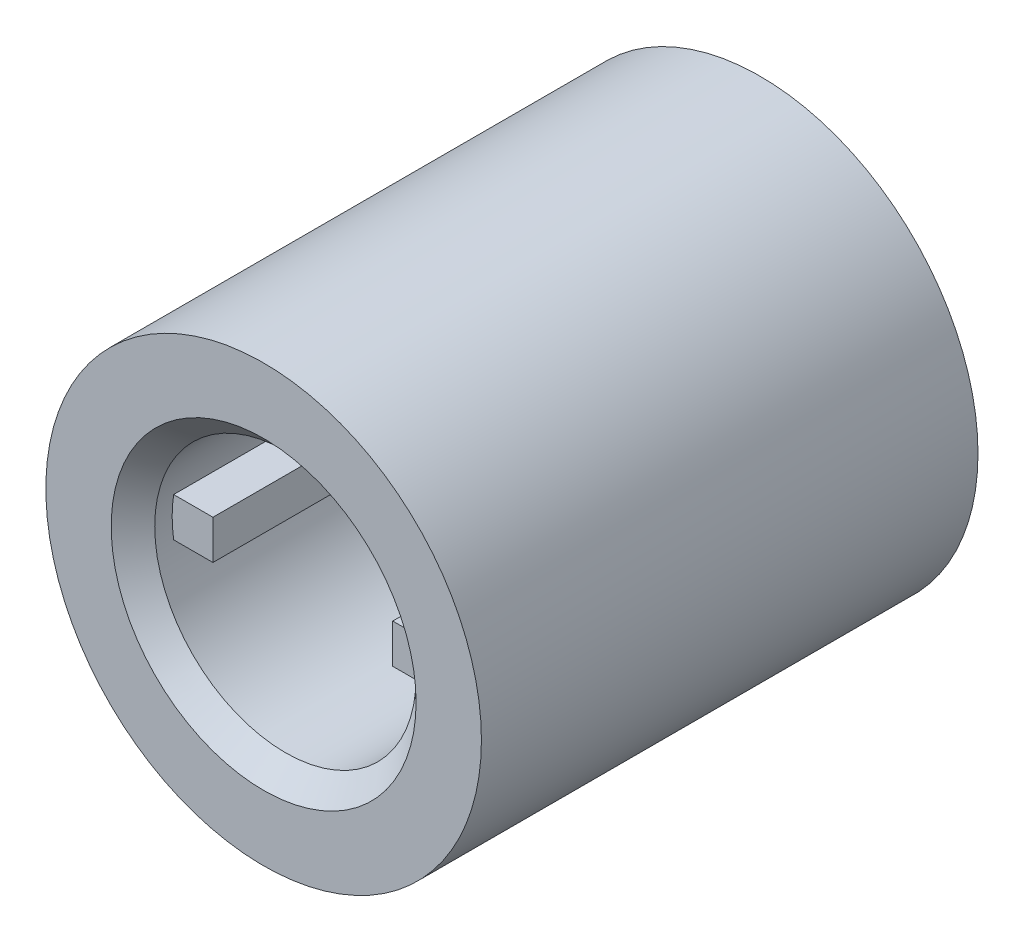
ISO-10303-21;
HEADER;
FILE_DESCRIPTION(('STEP AP214'),'2;1');
FILE_NAME('part.step','',(''),(''),'','','');
FILE_SCHEMA(('AUTOMOTIVE_DESIGN { 1 0 10303 214 1 1 1 1 }'));
ENDSEC;
DATA;
#1=APPLICATION_CONTEXT('core data for automotive mechanical design processes');
#2=APPLICATION_PROTOCOL_DEFINITION('international standard','automotive_design',2000,#1);
#3=PRODUCT_CONTEXT('',#1,'mechanical');
#4=PRODUCT('Part','Part','',(#3));
#5=PRODUCT_RELATED_PRODUCT_CATEGORY('part','',(#4));
#6=PRODUCT_DEFINITION_FORMATION('','',#4);
#7=PRODUCT_DEFINITION_CONTEXT('part definition',#1,'design');
#8=PRODUCT_DEFINITION('design','',#6,#7);
#9=PRODUCT_DEFINITION_SHAPE('','',#8);
#10=(LENGTH_UNIT() NAMED_UNIT(*) SI_UNIT(.MILLI.,.METRE.));
#11=(NAMED_UNIT(*) PLANE_ANGLE_UNIT() SI_UNIT($,.RADIAN.));
#12=(NAMED_UNIT(*) SI_UNIT($,.STERADIAN.) SOLID_ANGLE_UNIT());
#13=UNCERTAINTY_MEASURE_WITH_UNIT(LENGTH_MEASURE(1.E-05),#10,'distance_accuracy_value','');
#14=(GEOMETRIC_REPRESENTATION_CONTEXT(3) GLOBAL_UNCERTAINTY_ASSIGNED_CONTEXT((#13)) GLOBAL_UNIT_ASSIGNED_CONTEXT((#10,
#11,#12)) REPRESENTATION_CONTEXT('',''));
#15=CARTESIAN_POINT('',(0.,0.,0.));
#16=DIRECTION('',(0.,0.,1.));
#17=DIRECTION('',(1.,0.,0.));
#18=AXIS2_PLACEMENT_3D('',#15,#16,#17);
#19=CARTESIAN_POINT('',(0.,0.,-7.5));
#20=DIRECTION('',(0.,0.,1.));
#21=DIRECTION('',(1.,0.,0.));
#22=AXIS2_PLACEMENT_3D('',#19,#20,#21);
#23=CYLINDRICAL_SURFACE('',#22,3.);
#24=CARTESIAN_POINT('',(0.,0.,-7.));
#25=DIRECTION('',(0.,0.,1.));
#26=DIRECTION('',(1.,0.,0.));
#27=AXIS2_PLACEMENT_3D('',#24,#25,#26);
#28=CIRCLE('',#27,3.);
#29=CARTESIAN_POINT('',(3.,0.,-7.));
#30=VERTEX_POINT('',#29);
#31=EDGE_CURVE('E176',#30,#30,#28,.F.);
#32=ORIENTED_EDGE('',*,*,#31,.T.);
#33=EDGE_LOOP('',(#32));
#34=FACE_BOUND('',#33,.T.);
#35=CARTESIAN_POINT('',(0.,0.,3.4));
#36=DIRECTION('',(0.,0.,1.));
#37=DIRECTION('',(1.,0.,0.));
#38=AXIS2_PLACEMENT_3D('',#35,#36,#37);
#39=CIRCLE('',#38,3.);
#40=CARTESIAN_POINT('',(3.,0.,3.4));
#41=VERTEX_POINT('',#40);
#42=EDGE_CURVE('E179',#41,#41,#39,.T.);
#43=ORIENTED_EDGE('',*,*,#42,.T.);
#44=EDGE_LOOP('',(#43));
#45=FACE_BOUND('',#44,.T.);
#46=DIRECTION('',(0.,0.,1.));
#47=VECTOR('',#46,1.);
#48=CARTESIAN_POINT('',(-2.96605798999278,-0.45,-7.5));
#49=LINE('',#48,#47);
#50=CARTESIAN_POINT('',(-2.96605798999278,-0.45,3.));
#51=VERTEX_POINT('',#50);
#52=CARTESIAN_POINT('',(-2.96605798999278,-0.45,0.));
#53=VERTEX_POINT('',#52);
#54=EDGE_CURVE('E191',#51,#53,#49,.F.);
#55=ORIENTED_EDGE('',*,*,#54,.F.);
#56=CARTESIAN_POINT('',(0.,0.,3.));
#57=DIRECTION('',(0.,0.,1.));
#58=DIRECTION('',(1.,0.,0.));
#59=AXIS2_PLACEMENT_3D('',#56,#57,#58);
#60=CIRCLE('',#59,3.);
#61=CARTESIAN_POINT('',(-2.96605798999278,0.45,3.));
#62=VERTEX_POINT('',#61);
#63=EDGE_CURVE('E77',#51,#62,#60,.F.);
#64=ORIENTED_EDGE('',*,*,#63,.T.);
#65=DIRECTION('',(0.,0.,1.));
#66=VECTOR('',#65,1.);
#67=CARTESIAN_POINT('',(-2.96605798999278,0.45,-7.5));
#68=LINE('',#67,#66);
#69=CARTESIAN_POINT('',(-2.96605798999278,0.45,0.));
#70=VERTEX_POINT('',#69);
#71=EDGE_CURVE('E194',#70,#62,#68,.T.);
#72=ORIENTED_EDGE('',*,*,#71,.F.);
#73=CARTESIAN_POINT('',(0.,0.,0.));
#74=DIRECTION('',(0.,0.,1.));
#75=DIRECTION('',(1.,0.,0.));
#76=AXIS2_PLACEMENT_3D('',#73,#74,#75);
#77=CIRCLE('',#76,3.);
#78=EDGE_CURVE('E188',#53,#70,#77,.F.);
#79=ORIENTED_EDGE('',*,*,#78,.F.);
#80=EDGE_LOOP('',(#55,#64,#72,#79));
#81=FACE_BOUND('',#80,.T.);
#82=CARTESIAN_POINT('',(0.,0.,3.));
#83=DIRECTION('',(0.,0.,-1.));
#84=DIRECTION('',(-1.,0.,0.));
#85=AXIS2_PLACEMENT_3D('',#82,#83,#84);
#86=CIRCLE('',#85,3.);
#87=CARTESIAN_POINT('',(2.96605798999278,-0.45,3.));
#88=VERTEX_POINT('',#87);
#89=CARTESIAN_POINT('',(2.96605798999278,0.45,3.));
#90=VERTEX_POINT('',#89);
#91=EDGE_CURVE('E12',#88,#90,#86,.F.);
#92=ORIENTED_EDGE('',*,*,#91,.F.);
#93=DIRECTION('',(0.,0.,1.));
#94=VECTOR('',#93,1.);
#95=CARTESIAN_POINT('',(2.96605798999278,-0.45,-7.5));
#96=LINE('',#95,#94);
#97=CARTESIAN_POINT('',(2.96605798999278,-0.45,0.));
#98=VERTEX_POINT('',#97);
#99=EDGE_CURVE('E198',#98,#88,#96,.T.);
#100=ORIENTED_EDGE('',*,*,#99,.F.);
#101=CARTESIAN_POINT('',(0.,0.,0.));
#102=DIRECTION('',(0.,0.,-1.));
#103=DIRECTION('',(-1.,0.,0.));
#104=AXIS2_PLACEMENT_3D('',#101,#102,#103);
#105=CIRCLE('',#104,3.);
#106=CARTESIAN_POINT('',(2.96605798999278,0.45,0.));
#107=VERTEX_POINT('',#106);
#108=EDGE_CURVE('E138',#98,#107,#105,.F.);
#109=ORIENTED_EDGE('',*,*,#108,.T.);
#110=DIRECTION('',(0.,0.,1.));
#111=VECTOR('',#110,1.);
#112=CARTESIAN_POINT('',(2.96605798999278,0.45,-7.5));
#113=LINE('',#112,#111);
#114=EDGE_CURVE('E62',#90,#107,#113,.F.);
#115=ORIENTED_EDGE('',*,*,#114,.F.);
#116=EDGE_LOOP('',(#92,#100,#109,#115));
#117=FACE_BOUND('',#116,.T.);
#118=ADVANCED_FACE('F53',(#34,#45,#81,#117),#23,.F.);
#119=CARTESIAN_POINT('',(0.,0.,-7.5));
#120=DIRECTION('',(0.,0.,1.));
#121=DIRECTION('',(1.,0.,0.));
#122=AXIS2_PLACEMENT_3D('',#119,#120,#121);
#123=CYLINDRICAL_SURFACE('',#122,5.);
#124=CARTESIAN_POINT('',(0.,0.,-7.5));
#125=DIRECTION('',(0.,0.,1.));
#126=DIRECTION('',(1.,0.,0.));
#127=AXIS2_PLACEMENT_3D('',#124,#125,#126);
#128=CIRCLE('',#127,5.);
#129=CARTESIAN_POINT('',(5.,0.,-7.5));
#130=VERTEX_POINT('',#129);
#131=EDGE_CURVE('E173',#130,#130,#128,.T.);
#132=ORIENTED_EDGE('',*,*,#131,.T.);
#133=EDGE_LOOP('',(#132));
#134=FACE_BOUND('',#133,.T.);
#135=CARTESIAN_POINT('',(0.,0.,3.9));
#136=DIRECTION('',(0.,0.,1.));
#137=DIRECTION('',(1.,0.,0.));
#138=AXIS2_PLACEMENT_3D('',#135,#136,#137);
#139=CIRCLE('',#138,5.);
#140=CARTESIAN_POINT('',(5.,0.,3.9));
#141=VERTEX_POINT('',#140);
#142=EDGE_CURVE('E170',#141,#141,#139,.T.);
#143=ORIENTED_EDGE('',*,*,#142,.F.);
#144=EDGE_LOOP('',(#143));
#145=FACE_BOUND('',#144,.T.);
#146=ADVANCED_FACE('F217',(#134,#145),#123,.T.);
#147=CARTESIAN_POINT('',(0.,0.,-7.5));
#148=DIRECTION('',(0.,0.,1.));
#149=DIRECTION('',(1.,0.,0.));
#150=AXIS2_PLACEMENT_3D('',#147,#148,#149);
#151=PLANE('',#150);
#152=CARTESIAN_POINT('',(0.,0.,-7.5));
#153=DIRECTION('',(0.,0.,1.));
#154=DIRECTION('',(1.,0.,0.));
#155=AXIS2_PLACEMENT_3D('',#152,#153,#154);
#156=CIRCLE('',#155,3.5);
#157=CARTESIAN_POINT('',(3.5,0.,-7.5));
#158=VERTEX_POINT('',#157);
#159=EDGE_CURVE('E185',#158,#158,#156,.T.);
#160=ORIENTED_EDGE('',*,*,#159,.T.);
#161=EDGE_LOOP('',(#160));
#162=FACE_BOUND('',#161,.T.);
#163=ORIENTED_EDGE('',*,*,#131,.F.);
#164=EDGE_LOOP('',(#163));
#165=FACE_BOUND('',#164,.T.);
#166=ADVANCED_FACE('F225',(#162,#165),#151,.F.);
#167=CARTESIAN_POINT('',(0.,0.,3.9));
#168=DIRECTION('',(0.,0.,1.));
#169=DIRECTION('',(1.,0.,0.));
#170=AXIS2_PLACEMENT_3D('',#167,#168,#169);
#171=PLANE('',#170);
#172=CARTESIAN_POINT('',(0.,0.,3.9));
#173=DIRECTION('',(0.,0.,1.));
#174=DIRECTION('',(1.,0.,0.));
#175=AXIS2_PLACEMENT_3D('',#172,#173,#174);
#176=CIRCLE('',#175,3.5);
#177=CARTESIAN_POINT('',(3.5,0.,3.9));
#178=VERTEX_POINT('',#177);
#179=EDGE_CURVE('E182',#178,#178,#176,.F.);
#180=ORIENTED_EDGE('',*,*,#179,.T.);
#181=EDGE_LOOP('',(#180));
#182=FACE_BOUND('',#181,.T.);
#183=ORIENTED_EDGE('',*,*,#142,.T.);
#184=EDGE_LOOP('',(#183));
#185=FACE_BOUND('',#184,.T.);
#186=ADVANCED_FACE('F231',(#182,#185),#171,.T.);
#187=CARTESIAN_POINT('',(0.,0.,3.4));
#188=DIRECTION('',(0.,0.,1.));
#189=DIRECTION('',(1.,0.,0.));
#190=AXIS2_PLACEMENT_3D('',#187,#188,#189);
#191=CONICAL_SURFACE('',#190,3.,0.78539816339745);
#192=ORIENTED_EDGE('',*,*,#179,.F.);
#193=EDGE_LOOP('',(#192));
#194=FACE_BOUND('',#193,.T.);
#195=ORIENTED_EDGE('',*,*,#42,.F.);
#196=EDGE_LOOP('',(#195));
#197=FACE_BOUND('',#196,.T.);
#198=ADVANCED_FACE('F236',(#194,#197),#191,.F.);
#199=CARTESIAN_POINT('',(0.,0.,-7.5));
#200=DIRECTION('',(0.,0.,-1.));
#201=DIRECTION('',(-1.,0.,0.));
#202=AXIS2_PLACEMENT_3D('',#199,#200,#201);
#203=CONICAL_SURFACE('',#202,3.5,0.785398163397448);
#204=ORIENTED_EDGE('',*,*,#31,.F.);
#205=EDGE_LOOP('',(#204));
#206=FACE_BOUND('',#205,.T.);
#207=ORIENTED_EDGE('',*,*,#159,.F.);
#208=EDGE_LOOP('',(#207));
#209=FACE_BOUND('',#208,.T.);
#210=ADVANCED_FACE('F56',(#206,#209),#203,.F.);
#211=CARTESIAN_POINT('',(-3.30594204160702,0.45,3.));
#212=DIRECTION('',(0.,-1.,0.));
#213=DIRECTION('',(0.,0.,-1.));
#214=AXIS2_PLACEMENT_3D('',#211,#212,#213);
#215=PLANE('',#214);
#216=DIRECTION('',(-1.,0.,0.));
#217=VECTOR('',#216,1.);
#218=CARTESIAN_POINT('',(-3.30594204160702,0.45,0.));
#219=LINE('',#218,#217);
#220=CARTESIAN_POINT('',(-2.06367267843333,0.45,0.));
#221=VERTEX_POINT('',#220);
#222=EDGE_CURVE('E161',#221,#70,#219,.T.);
#223=ORIENTED_EDGE('',*,*,#222,.T.);
#224=ORIENTED_EDGE('',*,*,#71,.T.);
#225=DIRECTION('',(-1.,0.,0.));
#226=VECTOR('',#225,1.);
#227=CARTESIAN_POINT('',(-3.30594204160702,0.45,3.));
#228=LINE('',#227,#226);
#229=CARTESIAN_POINT('',(-2.06367267843333,0.45,3.));
#230=VERTEX_POINT('',#229);
#231=EDGE_CURVE('E152',#230,#62,#228,.T.);
#232=ORIENTED_EDGE('',*,*,#231,.F.);
#233=DIRECTION('',(0.,0.,-1.));
#234=VECTOR('',#233,1.);
#235=CARTESIAN_POINT('',(-2.06367267843333,0.45,3.));
#236=LINE('',#235,#234);
#237=EDGE_CURVE('E167',#230,#221,#236,.T.);
#238=ORIENTED_EDGE('',*,*,#237,.T.);
#239=EDGE_LOOP('',(#223,#224,#232,#238));
#240=FACE_BOUND('',#239,.T.);
#241=ADVANCED_FACE('F244',(#240),#215,.F.);
#242=CARTESIAN_POINT('',(-3.30594204160702,-0.45,3.));
#243=DIRECTION('',(0.,1.,0.));
#244=DIRECTION('',(0.,0.,1.));
#245=AXIS2_PLACEMENT_3D('',#242,#243,#244);
#246=PLANE('',#245);
#247=DIRECTION('',(1.,0.,0.));
#248=VECTOR('',#247,1.);
#249=CARTESIAN_POINT('',(-3.30594204160702,-0.45,3.));
#250=LINE('',#249,#248);
#251=CARTESIAN_POINT('',(-2.06367267843333,-0.45,3.));
#252=VERTEX_POINT('',#251);
#253=EDGE_CURVE('E156',#51,#252,#250,.T.);
#254=ORIENTED_EDGE('',*,*,#253,.F.);
#255=ORIENTED_EDGE('',*,*,#54,.T.);
#256=DIRECTION('',(1.,0.,0.));
#257=VECTOR('',#256,1.);
#258=CARTESIAN_POINT('',(-3.30594204160702,-0.45,0.));
#259=LINE('',#258,#257);
#260=CARTESIAN_POINT('',(-2.06367267843333,-0.45,0.));
#261=VERTEX_POINT('',#260);
#262=EDGE_CURVE('E153',#53,#261,#259,.T.);
#263=ORIENTED_EDGE('',*,*,#262,.T.);
#264=DIRECTION('',(0.,0.,-1.));
#265=VECTOR('',#264,1.);
#266=CARTESIAN_POINT('',(-2.06367267843333,-0.45,3.));
#267=LINE('',#266,#265);
#268=EDGE_CURVE('E158',#252,#261,#267,.T.);
#269=ORIENTED_EDGE('',*,*,#268,.F.);
#270=EDGE_LOOP('',(#254,#255,#263,#269));
#271=FACE_BOUND('',#270,.T.);
#272=ADVANCED_FACE('F256',(#271),#246,.F.);
#273=CARTESIAN_POINT('',(0.,0.,3.));
#274=DIRECTION('',(0.,0.,1.));
#275=DIRECTION('',(1.,0.,0.));
#276=AXIS2_PLACEMENT_3D('',#273,#274,#275);
#277=PLANE('',#276);
#278=ORIENTED_EDGE('',*,*,#63,.F.);
#279=ORIENTED_EDGE('',*,*,#253,.T.);
#280=DIRECTION('',(0.,1.,0.));
#281=VECTOR('',#280,1.);
#282=CARTESIAN_POINT('',(-2.06367267843333,0.45,3.));
#283=LINE('',#282,#281);
#284=EDGE_CURVE('E149',#252,#230,#283,.T.);
#285=ORIENTED_EDGE('',*,*,#284,.T.);
#286=ORIENTED_EDGE('',*,*,#231,.T.);
#287=EDGE_LOOP('',(#278,#279,#285,#286));
#288=FACE_BOUND('',#287,.T.);
#289=ADVANCED_FACE('F254',(#288),#277,.T.);
#290=CARTESIAN_POINT('',(0.,0.,0.));
#291=DIRECTION('',(0.,0.,1.));
#292=DIRECTION('',(1.,0.,0.));
#293=AXIS2_PLACEMENT_3D('',#290,#291,#292);
#294=PLANE('',#293);
#295=ORIENTED_EDGE('',*,*,#262,.F.);
#296=ORIENTED_EDGE('',*,*,#78,.T.);
#297=ORIENTED_EDGE('',*,*,#222,.F.);
#298=DIRECTION('',(0.,1.,0.));
#299=VECTOR('',#298,1.);
#300=CARTESIAN_POINT('',(-2.06367267843333,0.45,0.));
#301=LINE('',#300,#299);
#302=EDGE_CURVE('E146',#261,#221,#301,.T.);
#303=ORIENTED_EDGE('',*,*,#302,.F.);
#304=EDGE_LOOP('',(#295,#296,#297,#303));
#305=FACE_BOUND('',#304,.T.);
#306=ADVANCED_FACE('F264',(#305),#294,.F.);
#307=CARTESIAN_POINT('',(-2.06367267843333,0.45,3.));
#308=DIRECTION('',(-1.,0.,0.));
#309=DIRECTION('',(0.,0.,1.));
#310=AXIS2_PLACEMENT_3D('',#307,#308,#309);
#311=PLANE('',#310);
#312=ORIENTED_EDGE('',*,*,#302,.T.);
#313=ORIENTED_EDGE('',*,*,#237,.F.);
#314=ORIENTED_EDGE('',*,*,#284,.F.);
#315=ORIENTED_EDGE('',*,*,#268,.T.);
#316=EDGE_LOOP('',(#312,#313,#314,#315));
#317=FACE_BOUND('',#316,.T.);
#318=ADVANCED_FACE('F261',(#317),#311,.F.);
#319=CARTESIAN_POINT('',(3.30594204160702,0.45,3.));
#320=DIRECTION('',(0.,-1.,0.));
#321=DIRECTION('',(0.,0.,-1.));
#322=AXIS2_PLACEMENT_3D('',#319,#320,#321);
#323=PLANE('',#322);
#324=DIRECTION('',(-1.,0.,0.));
#325=VECTOR('',#324,1.);
#326=CARTESIAN_POINT('',(3.30594204160702,0.45,3.));
#327=LINE('',#326,#325);
#328=CARTESIAN_POINT('',(2.06367267843333,0.45,3.));
#329=VERTEX_POINT('',#328);
#330=EDGE_CURVE('E139',#90,#329,#327,.T.);
#331=ORIENTED_EDGE('',*,*,#330,.F.);
#332=ORIENTED_EDGE('',*,*,#114,.T.);
#333=DIRECTION('',(-1.,0.,0.));
#334=VECTOR('',#333,1.);
#335=CARTESIAN_POINT('',(3.30594204160702,0.45,0.));
#336=LINE('',#335,#334);
#337=CARTESIAN_POINT('',(2.06367267843333,0.45,0.));
#338=VERTEX_POINT('',#337);
#339=EDGE_CURVE('E69',#107,#338,#336,.T.);
#340=ORIENTED_EDGE('',*,*,#339,.T.);
#341=DIRECTION('',(0.,0.,-1.));
#342=VECTOR('',#341,1.);
#343=CARTESIAN_POINT('',(2.06367267843333,0.45,3.));
#344=LINE('',#343,#342);
#345=EDGE_CURVE('E125',#329,#338,#344,.T.);
#346=ORIENTED_EDGE('',*,*,#345,.F.);
#347=EDGE_LOOP('',(#331,#332,#340,#346));
#348=FACE_BOUND('',#347,.T.);
#349=ADVANCED_FACE('F202',(#348),#323,.F.);
#350=CARTESIAN_POINT('',(3.30594204160702,-0.45,3.));
#351=DIRECTION('',(0.,1.,0.));
#352=DIRECTION('',(0.,0.,1.));
#353=AXIS2_PLACEMENT_3D('',#350,#351,#352);
#354=PLANE('',#353);
#355=DIRECTION('',(1.,0.,0.));
#356=VECTOR('',#355,1.);
#357=CARTESIAN_POINT('',(3.30594204160702,-0.45,0.));
#358=LINE('',#357,#356);
#359=CARTESIAN_POINT('',(2.06367267843333,-0.45,0.));
#360=VERTEX_POINT('',#359);
#361=EDGE_CURVE('E127',#360,#98,#358,.T.);
#362=ORIENTED_EDGE('',*,*,#361,.T.);
#363=ORIENTED_EDGE('',*,*,#99,.T.);
#364=DIRECTION('',(1.,0.,0.));
#365=VECTOR('',#364,1.);
#366=CARTESIAN_POINT('',(3.30594204160702,-0.45,3.));
#367=LINE('',#366,#365);
#368=CARTESIAN_POINT('',(2.06367267843333,-0.45,3.));
#369=VERTEX_POINT('',#368);
#370=EDGE_CURVE('E134',#369,#88,#367,.T.);
#371=ORIENTED_EDGE('',*,*,#370,.F.);
#372=DIRECTION('',(0.,0.,-1.));
#373=VECTOR('',#372,1.);
#374=CARTESIAN_POINT('',(2.06367267843333,-0.45,3.));
#375=LINE('',#374,#373);
#376=EDGE_CURVE('E122',#369,#360,#375,.T.);
#377=ORIENTED_EDGE('',*,*,#376,.T.);
#378=EDGE_LOOP('',(#362,#363,#371,#377));
#379=FACE_BOUND('',#378,.T.);
#380=ADVANCED_FACE('F131',(#379),#354,.F.);
#381=CARTESIAN_POINT('',(0.,0.,3.));
#382=DIRECTION('',(0.,0.,-1.));
#383=DIRECTION('',(-1.,0.,0.));
#384=AXIS2_PLACEMENT_3D('',#381,#382,#383);
#385=PLANE('',#384);
#386=ORIENTED_EDGE('',*,*,#370,.T.);
#387=ORIENTED_EDGE('',*,*,#91,.T.);
#388=ORIENTED_EDGE('',*,*,#330,.T.);
#389=DIRECTION('',(0.,-1.,0.));
#390=VECTOR('',#389,1.);
#391=CARTESIAN_POINT('',(2.06367267843333,0.45,3.));
#392=LINE('',#391,#390);
#393=EDGE_CURVE('E141',#329,#369,#392,.T.);
#394=ORIENTED_EDGE('',*,*,#393,.T.);
#395=EDGE_LOOP('',(#386,#387,#388,#394));
#396=FACE_BOUND('',#395,.T.);
#397=ADVANCED_FACE('F206',(#396),#385,.F.);
#398=CARTESIAN_POINT('',(0.,0.,0.));
#399=DIRECTION('',(0.,0.,-1.));
#400=DIRECTION('',(-1.,0.,0.));
#401=AXIS2_PLACEMENT_3D('',#398,#399,#400);
#402=PLANE('',#401);
#403=ORIENTED_EDGE('',*,*,#108,.F.);
#404=ORIENTED_EDGE('',*,*,#361,.F.);
#405=DIRECTION('',(0.,-1.,0.));
#406=VECTOR('',#405,1.);
#407=CARTESIAN_POINT('',(2.06367267843333,0.45,0.));
#408=LINE('',#407,#406);
#409=EDGE_CURVE('E118',#338,#360,#408,.T.);
#410=ORIENTED_EDGE('',*,*,#409,.F.);
#411=ORIENTED_EDGE('',*,*,#339,.F.);
#412=EDGE_LOOP('',(#403,#404,#410,#411));
#413=FACE_BOUND('',#412,.T.);
#414=ADVANCED_FACE('F136',(#413),#402,.T.);
#415=CARTESIAN_POINT('',(2.06367267843333,0.45,3.));
#416=DIRECTION('',(1.,0.,0.));
#417=DIRECTION('',(0.,0.,-1.));
#418=AXIS2_PLACEMENT_3D('',#415,#416,#417);
#419=PLANE('',#418);
#420=ORIENTED_EDGE('',*,*,#409,.T.);
#421=ORIENTED_EDGE('',*,*,#376,.F.);
#422=ORIENTED_EDGE('',*,*,#393,.F.);
#423=ORIENTED_EDGE('',*,*,#345,.T.);
#424=EDGE_LOOP('',(#420,#421,#422,#423));
#425=FACE_BOUND('',#424,.T.);
#426=ADVANCED_FACE('F120',(#425),#419,.F.);
#427=CLOSED_SHELL('',(#118,#146,#166,#186,#198,#210,#241,#272,#289,#306,#318,#349,#380,#397,
#414,#426));
#428=MANIFOLD_SOLID_BREP('B2',#427);
#429=ADVANCED_BREP_SHAPE_REPRESENTATION('',(#18,#428),#14);
#430=SHAPE_DEFINITION_REPRESENTATION(#9,#429);
ENDSEC;
END-ISO-10303-21;
